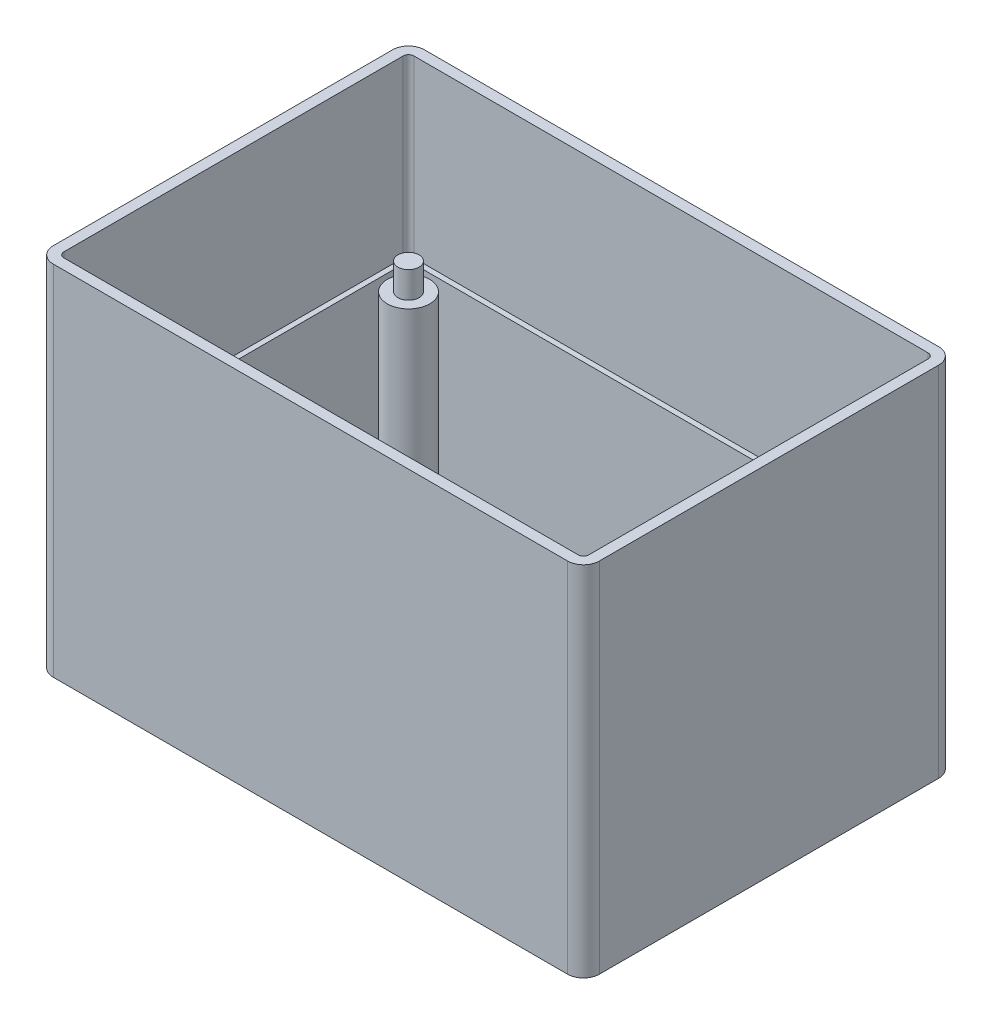
ISO-10303-21;
HEADER;
FILE_DESCRIPTION(('STEP AP214'),'2;1');
FILE_NAME('part.step','',(''),(''),'','','');
FILE_SCHEMA(('AUTOMOTIVE_DESIGN { 1 0 10303 214 1 1 1 1 }'));
ENDSEC;
DATA;
#1=APPLICATION_CONTEXT('core data for automotive mechanical design processes');
#2=APPLICATION_PROTOCOL_DEFINITION('international standard','automotive_design',2000,#1);
#3=PRODUCT_CONTEXT('',#1,'mechanical');
#4=PRODUCT('Part','Part','',(#3));
#5=PRODUCT_RELATED_PRODUCT_CATEGORY('part','',(#4));
#6=PRODUCT_DEFINITION_FORMATION('','',#4);
#7=PRODUCT_DEFINITION_CONTEXT('part definition',#1,'design');
#8=PRODUCT_DEFINITION('design','',#6,#7);
#9=PRODUCT_DEFINITION_SHAPE('','',#8);
#10=(LENGTH_UNIT() NAMED_UNIT(*) SI_UNIT(.MILLI.,.METRE.));
#11=(NAMED_UNIT(*) PLANE_ANGLE_UNIT() SI_UNIT($,.RADIAN.));
#12=(NAMED_UNIT(*) SI_UNIT($,.STERADIAN.) SOLID_ANGLE_UNIT());
#13=UNCERTAINTY_MEASURE_WITH_UNIT(LENGTH_MEASURE(1.E-05),#10,'distance_accuracy_value','');
#14=(GEOMETRIC_REPRESENTATION_CONTEXT(3) GLOBAL_UNCERTAINTY_ASSIGNED_CONTEXT((#13)) GLOBAL_UNIT_ASSIGNED_CONTEXT((#10,
#11,#12)) REPRESENTATION_CONTEXT('',''));
#15=CARTESIAN_POINT('',(0.,0.,0.));
#16=DIRECTION('',(0.,0.,1.));
#17=DIRECTION('',(1.,0.,0.));
#18=AXIS2_PLACEMENT_3D('',#15,#16,#17);
#19=CARTESIAN_POINT('',(103.,-2.5,0.));
#20=DIRECTION('',(1.,0.,0.));
#21=DIRECTION('',(0.,0.,-1.));
#22=AXIS2_PLACEMENT_3D('',#19,#20,#21);
#23=PLANE('',#22);
#24=DIRECTION('',(0.,1.,0.));
#25=VECTOR('',#24,1.);
#26=CARTESIAN_POINT('',(103.,-2.5,-67.));
#27=LINE('',#26,#25);
#28=CARTESIAN_POINT('',(103.,-2.5,-67.));
#29=VERTEX_POINT('',#28);
#30=CARTESIAN_POINT('',(103.,65.,-67.));
#31=VERTEX_POINT('',#30);
#32=EDGE_CURVE('E335',#29,#31,#27,.T.);
#33=ORIENTED_EDGE('',*,*,#32,.T.);
#34=DIRECTION('',(0.,0.,-1.));
#35=VECTOR('',#34,1.);
#36=CARTESIAN_POINT('',(103.,65.,0.));
#37=LINE('',#36,#35);
#38=CARTESIAN_POINT('',(103.,65.,-3.00000000000002));
#39=VERTEX_POINT('',#38);
#40=EDGE_CURVE('E427',#39,#31,#37,.T.);
#41=ORIENTED_EDGE('',*,*,#40,.F.);
#42=DIRECTION('',(0.,1.,0.));
#43=VECTOR('',#42,1.);
#44=CARTESIAN_POINT('',(103.,-2.5,-3.00000000000002));
#45=LINE('',#44,#43);
#46=CARTESIAN_POINT('',(103.,-2.5,-3.00000000000002));
#47=VERTEX_POINT('',#46);
#48=EDGE_CURVE('E336',#47,#39,#45,.T.);
#49=ORIENTED_EDGE('',*,*,#48,.F.);
#50=DIRECTION('',(0.,0.,-1.));
#51=VECTOR('',#50,1.);
#52=CARTESIAN_POINT('',(103.,-2.5,0.));
#53=LINE('',#52,#51);
#54=EDGE_CURVE('E310',#47,#29,#53,.T.);
#55=ORIENTED_EDGE('',*,*,#54,.T.);
#56=EDGE_LOOP('',(#33,#41,#49,#55));
#57=FACE_BOUND('',#56,.T.);
#58=ADVANCED_FACE('F149',(#57),#23,.T.);
#59=CARTESIAN_POINT('',(100.,-2.5,-3.));
#60=DIRECTION('',(0.,1.,0.));
#61=DIRECTION('',(0.,0.,1.));
#62=AXIS2_PLACEMENT_3D('',#59,#60,#61);
#63=CYLINDRICAL_SURFACE('',#62,3.);
#64=ORIENTED_EDGE('',*,*,#48,.T.);
#65=CARTESIAN_POINT('',(100.,65.,-3.));
#66=DIRECTION('',(0.,1.,0.));
#67=DIRECTION('',(0.,0.,1.));
#68=AXIS2_PLACEMENT_3D('',#65,#66,#67);
#69=CIRCLE('',#68,3.);
#70=CARTESIAN_POINT('',(100.,65.,0.));
#71=VERTEX_POINT('',#70);
#72=EDGE_CURVE('E448',#39,#71,#69,.F.);
#73=ORIENTED_EDGE('',*,*,#72,.T.);
#74=DIRECTION('',(0.,1.,0.));
#75=VECTOR('',#74,1.);
#76=CARTESIAN_POINT('',(100.,-2.5,0.));
#77=LINE('',#76,#75);
#78=CARTESIAN_POINT('',(100.,-2.5,0.));
#79=VERTEX_POINT('',#78);
#80=EDGE_CURVE('E339',#79,#71,#77,.T.);
#81=ORIENTED_EDGE('',*,*,#80,.F.);
#82=CARTESIAN_POINT('',(100.,-2.5,-3.));
#83=DIRECTION('',(0.,1.,0.));
#84=DIRECTION('',(0.,0.,1.));
#85=AXIS2_PLACEMENT_3D('',#82,#83,#84);
#86=CIRCLE('',#85,3.);
#87=EDGE_CURVE('E333',#47,#79,#86,.F.);
#88=ORIENTED_EDGE('',*,*,#87,.F.);
#89=EDGE_LOOP('',(#64,#73,#81,#88));
#90=FACE_BOUND('',#89,.T.);
#91=ADVANCED_FACE('F514',(#90),#63,.T.);
#92=CARTESIAN_POINT('',(0.,-2.5,0.));
#93=DIRECTION('',(0.,0.,1.));
#94=DIRECTION('',(1.,0.,0.));
#95=AXIS2_PLACEMENT_3D('',#92,#93,#94);
#96=PLANE('',#95);
#97=ORIENTED_EDGE('',*,*,#80,.T.);
#98=DIRECTION('',(1.,0.,0.));
#99=VECTOR('',#98,1.);
#100=CARTESIAN_POINT('',(0.,65.,0.));
#101=LINE('',#100,#99);
#102=CARTESIAN_POINT('',(3.00000000000002,65.,0.));
#103=VERTEX_POINT('',#102);
#104=EDGE_CURVE('E445',#103,#71,#101,.T.);
#105=ORIENTED_EDGE('',*,*,#104,.F.);
#106=DIRECTION('',(0.,1.,0.));
#107=VECTOR('',#106,1.);
#108=CARTESIAN_POINT('',(3.00000000000002,-2.5,0.));
#109=LINE('',#108,#107);
#110=CARTESIAN_POINT('',(3.00000000000002,-2.5,0.));
#111=VERTEX_POINT('',#110);
#112=EDGE_CURVE('E341',#111,#103,#109,.T.);
#113=ORIENTED_EDGE('',*,*,#112,.F.);
#114=DIRECTION('',(1.,0.,0.));
#115=VECTOR('',#114,1.);
#116=CARTESIAN_POINT('',(0.,-2.5,0.));
#117=LINE('',#116,#115);
#118=EDGE_CURVE('E330',#111,#79,#117,.T.);
#119=ORIENTED_EDGE('',*,*,#118,.T.);
#120=EDGE_LOOP('',(#97,#105,#113,#119));
#121=FACE_BOUND('',#120,.T.);
#122=ADVANCED_FACE('F519',(#121),#96,.T.);
#123=CARTESIAN_POINT('',(3.,-2.5,-3.));
#124=DIRECTION('',(0.,1.,0.));
#125=DIRECTION('',(0.,0.,1.));
#126=AXIS2_PLACEMENT_3D('',#123,#124,#125);
#127=CYLINDRICAL_SURFACE('',#126,3.);
#128=ORIENTED_EDGE('',*,*,#112,.T.);
#129=CARTESIAN_POINT('',(3.,65.,-3.));
#130=DIRECTION('',(0.,1.,0.));
#131=DIRECTION('',(0.,0.,1.));
#132=AXIS2_PLACEMENT_3D('',#129,#130,#131);
#133=CIRCLE('',#132,3.);
#134=CARTESIAN_POINT('',(0.,65.,-3.00000000000002));
#135=VERTEX_POINT('',#134);
#136=EDGE_CURVE('E442',#103,#135,#133,.F.);
#137=ORIENTED_EDGE('',*,*,#136,.T.);
#138=DIRECTION('',(0.,1.,0.));
#139=VECTOR('',#138,1.);
#140=CARTESIAN_POINT('',(0.,-2.5,-3.00000000000002));
#141=LINE('',#140,#139);
#142=CARTESIAN_POINT('',(0.,-2.5,-3.00000000000002));
#143=VERTEX_POINT('',#142);
#144=EDGE_CURVE('E343',#143,#135,#141,.T.);
#145=ORIENTED_EDGE('',*,*,#144,.F.);
#146=CARTESIAN_POINT('',(3.,-2.5,-3.));
#147=DIRECTION('',(0.,1.,0.));
#148=DIRECTION('',(0.,0.,1.));
#149=AXIS2_PLACEMENT_3D('',#146,#147,#148);
#150=CIRCLE('',#149,3.);
#151=EDGE_CURVE('E328',#111,#143,#150,.F.);
#152=ORIENTED_EDGE('',*,*,#151,.F.);
#153=EDGE_LOOP('',(#128,#137,#145,#152));
#154=FACE_BOUND('',#153,.T.);
#155=ADVANCED_FACE('F554',(#154),#127,.T.);
#156=CARTESIAN_POINT('',(0.,-2.5,0.));
#157=DIRECTION('',(1.,0.,0.));
#158=DIRECTION('',(0.,0.,-1.));
#159=AXIS2_PLACEMENT_3D('',#156,#157,#158);
#160=PLANE('',#159);
#161=ORIENTED_EDGE('',*,*,#144,.T.);
#162=DIRECTION('',(0.,0.,-1.));
#163=VECTOR('',#162,1.);
#164=CARTESIAN_POINT('',(0.,65.,0.));
#165=LINE('',#164,#163);
#166=CARTESIAN_POINT('',(0.,65.,-67.));
#167=VERTEX_POINT('',#166);
#168=EDGE_CURVE('E439',#135,#167,#165,.T.);
#169=ORIENTED_EDGE('',*,*,#168,.T.);
#170=DIRECTION('',(0.,1.,0.));
#171=VECTOR('',#170,1.);
#172=CARTESIAN_POINT('',(0.,-2.5,-67.));
#173=LINE('',#172,#171);
#174=CARTESIAN_POINT('',(0.,-2.5,-67.));
#175=VERTEX_POINT('',#174);
#176=EDGE_CURVE('E345',#175,#167,#173,.T.);
#177=ORIENTED_EDGE('',*,*,#176,.F.);
#178=DIRECTION('',(0.,0.,-1.));
#179=VECTOR('',#178,1.);
#180=CARTESIAN_POINT('',(0.,-2.5,0.));
#181=LINE('',#180,#179);
#182=EDGE_CURVE('E326',#143,#175,#181,.T.);
#183=ORIENTED_EDGE('',*,*,#182,.F.);
#184=EDGE_LOOP('',(#161,#169,#177,#183));
#185=FACE_BOUND('',#184,.T.);
#186=ADVANCED_FACE('F551',(#185),#160,.F.);
#187=CARTESIAN_POINT('',(3.,-2.5,-67.));
#188=DIRECTION('',(0.,1.,0.));
#189=DIRECTION('',(0.,0.,1.));
#190=AXIS2_PLACEMENT_3D('',#187,#188,#189);
#191=CYLINDRICAL_SURFACE('',#190,3.);
#192=ORIENTED_EDGE('',*,*,#176,.T.);
#193=CARTESIAN_POINT('',(3.,65.,-67.));
#194=DIRECTION('',(0.,1.,0.));
#195=DIRECTION('',(0.,0.,1.));
#196=AXIS2_PLACEMENT_3D('',#193,#194,#195);
#197=CIRCLE('',#196,3.);
#198=CARTESIAN_POINT('',(3.00000000000002,65.,-70.));
#199=VERTEX_POINT('',#198);
#200=EDGE_CURVE('E436',#167,#199,#197,.F.);
#201=ORIENTED_EDGE('',*,*,#200,.T.);
#202=DIRECTION('',(0.,1.,0.));
#203=VECTOR('',#202,1.);
#204=CARTESIAN_POINT('',(3.00000000000002,-2.5,-70.));
#205=LINE('',#204,#203);
#206=CARTESIAN_POINT('',(3.00000000000002,-2.5,-70.));
#207=VERTEX_POINT('',#206);
#208=EDGE_CURVE('E347',#207,#199,#205,.T.);
#209=ORIENTED_EDGE('',*,*,#208,.F.);
#210=CARTESIAN_POINT('',(3.,-2.5,-67.));
#211=DIRECTION('',(0.,1.,0.));
#212=DIRECTION('',(0.,0.,1.));
#213=AXIS2_PLACEMENT_3D('',#210,#211,#212);
#214=CIRCLE('',#213,3.);
#215=EDGE_CURVE('E324',#175,#207,#214,.F.);
#216=ORIENTED_EDGE('',*,*,#215,.F.);
#217=EDGE_LOOP('',(#192,#201,#209,#216));
#218=FACE_BOUND('',#217,.T.);
#219=ADVANCED_FACE('F547',(#218),#191,.T.);
#220=CARTESIAN_POINT('',(0.,-2.5,-70.));
#221=DIRECTION('',(0.,0.,1.));
#222=DIRECTION('',(1.,0.,0.));
#223=AXIS2_PLACEMENT_3D('',#220,#221,#222);
#224=PLANE('',#223);
#225=ORIENTED_EDGE('',*,*,#208,.T.);
#226=DIRECTION('',(1.,0.,0.));
#227=VECTOR('',#226,1.);
#228=CARTESIAN_POINT('',(0.,65.,-70.));
#229=LINE('',#228,#227);
#230=CARTESIAN_POINT('',(100.,65.,-70.));
#231=VERTEX_POINT('',#230);
#232=EDGE_CURVE('E433',#199,#231,#229,.T.);
#233=ORIENTED_EDGE('',*,*,#232,.T.);
#234=DIRECTION('',(0.,1.,0.));
#235=VECTOR('',#234,1.);
#236=CARTESIAN_POINT('',(100.,-2.5,-70.));
#237=LINE('',#236,#235);
#238=CARTESIAN_POINT('',(100.,-2.5,-70.));
#239=VERTEX_POINT('',#238);
#240=EDGE_CURVE('E349',#239,#231,#237,.T.);
#241=ORIENTED_EDGE('',*,*,#240,.F.);
#242=DIRECTION('',(1.,0.,0.));
#243=VECTOR('',#242,1.);
#244=CARTESIAN_POINT('',(0.,-2.5,-70.));
#245=LINE('',#244,#243);
#246=EDGE_CURVE('E322',#207,#239,#245,.T.);
#247=ORIENTED_EDGE('',*,*,#246,.F.);
#248=EDGE_LOOP('',(#225,#233,#241,#247));
#249=FACE_BOUND('',#248,.T.);
#250=ADVANCED_FACE('F543',(#249),#224,.F.);
#251=CARTESIAN_POINT('',(100.,-2.5,-67.));
#252=DIRECTION('',(0.,1.,0.));
#253=DIRECTION('',(0.,0.,1.));
#254=AXIS2_PLACEMENT_3D('',#251,#252,#253);
#255=CYLINDRICAL_SURFACE('',#254,3.);
#256=ORIENTED_EDGE('',*,*,#240,.T.);
#257=CARTESIAN_POINT('',(100.,65.,-67.));
#258=DIRECTION('',(0.,1.,0.));
#259=DIRECTION('',(0.,0.,1.));
#260=AXIS2_PLACEMENT_3D('',#257,#258,#259);
#261=CIRCLE('',#260,3.);
#262=EDGE_CURVE('E430',#31,#231,#261,.T.);
#263=ORIENTED_EDGE('',*,*,#262,.F.);
#264=ORIENTED_EDGE('',*,*,#32,.F.);
#265=CARTESIAN_POINT('',(100.,-2.5,-67.));
#266=DIRECTION('',(0.,1.,0.));
#267=DIRECTION('',(0.,0.,1.));
#268=AXIS2_PLACEMENT_3D('',#265,#266,#267);
#269=CIRCLE('',#268,3.);
#270=EDGE_CURVE('E314',#29,#239,#269,.T.);
#271=ORIENTED_EDGE('',*,*,#270,.T.);
#272=EDGE_LOOP('',(#256,#263,#264,#271));
#273=FACE_BOUND('',#272,.T.);
#274=ADVANCED_FACE('F528',(#273),#255,.T.);
#275=CARTESIAN_POINT('',(0.,-2.5,0.));
#276=DIRECTION('',(0.,1.,0.));
#277=DIRECTION('',(0.,0.,1.));
#278=AXIS2_PLACEMENT_3D('',#275,#276,#277);
#279=PLANE('',#278);
#280=ORIENTED_EDGE('',*,*,#54,.F.);
#281=ORIENTED_EDGE('',*,*,#87,.T.);
#282=ORIENTED_EDGE('',*,*,#118,.F.);
#283=ORIENTED_EDGE('',*,*,#151,.T.);
#284=ORIENTED_EDGE('',*,*,#182,.T.);
#285=ORIENTED_EDGE('',*,*,#215,.T.);
#286=ORIENTED_EDGE('',*,*,#246,.T.);
#287=ORIENTED_EDGE('',*,*,#270,.F.);
#288=EDGE_LOOP('',(#280,#281,#282,#283,#284,#285,#286,#287));
#289=FACE_BOUND('',#288,.T.);
#290=ADVANCED_FACE('F538',(#289),#279,.F.);
#291=CARTESIAN_POINT('',(0.,65.,-2.));
#292=DIRECTION('',(0.,0.,-1.));
#293=DIRECTION('',(-1.,0.,0.));
#294=AXIS2_PLACEMENT_3D('',#291,#292,#293);
#295=PLANE('',#294);
#296=DIRECTION('',(1.,0.,0.));
#297=VECTOR('',#296,1.);
#298=CARTESIAN_POINT('',(0.,32.,-2.));
#299=LINE('',#298,#297);
#300=CARTESIAN_POINT('',(3.00000000000002,32.,-2.));
#301=VERTEX_POINT('',#300);
#302=CARTESIAN_POINT('',(100.,32.,-2.));
#303=VERTEX_POINT('',#302);
#304=EDGE_CURVE('E165',#301,#303,#299,.T.);
#305=ORIENTED_EDGE('',*,*,#304,.F.);
#306=DIRECTION('',(0.,-1.,0.));
#307=VECTOR('',#306,1.);
#308=CARTESIAN_POINT('',(3.00000000000002,65.,-2.));
#309=LINE('',#308,#307);
#310=CARTESIAN_POINT('',(3.00000000000002,65.,-2.));
#311=VERTEX_POINT('',#310);
#312=EDGE_CURVE('E300',#311,#301,#309,.T.);
#313=ORIENTED_EDGE('',*,*,#312,.F.);
#314=DIRECTION('',(1.,0.,0.));
#315=VECTOR('',#314,1.);
#316=CARTESIAN_POINT('',(0.,65.,-2.));
#317=LINE('',#316,#315);
#318=CARTESIAN_POINT('',(100.,65.,-2.));
#319=VERTEX_POINT('',#318);
#320=EDGE_CURVE('E451',#311,#319,#317,.T.);
#321=ORIENTED_EDGE('',*,*,#320,.T.);
#322=DIRECTION('',(0.,-1.,0.));
#323=VECTOR('',#322,1.);
#324=CARTESIAN_POINT('',(100.,65.,-2.));
#325=LINE('',#324,#323);
#326=EDGE_CURVE('E303',#319,#303,#325,.T.);
#327=ORIENTED_EDGE('',*,*,#326,.T.);
#328=EDGE_LOOP('',(#305,#313,#321,#327));
#329=FACE_BOUND('',#328,.T.);
#330=ADVANCED_FACE('F298',(#329),#295,.T.);
#331=CARTESIAN_POINT('',(3.,65.,-3.));
#332=DIRECTION('',(0.,-1.,0.));
#333=DIRECTION('',(0.,0.,-1.));
#334=AXIS2_PLACEMENT_3D('',#331,#332,#333);
#335=CYLINDRICAL_SURFACE('',#334,1.);
#336=ORIENTED_EDGE('',*,*,#312,.T.);
#337=CARTESIAN_POINT('',(3.,32.,-3.));
#338=DIRECTION('',(0.,1.,0.));
#339=DIRECTION('',(0.,0.,1.));
#340=AXIS2_PLACEMENT_3D('',#337,#338,#339);
#341=CIRCLE('',#340,1.);
#342=CARTESIAN_POINT('',(2.,32.,-3.00000000000002));
#343=VERTEX_POINT('',#342);
#344=EDGE_CURVE('E285',#301,#343,#341,.F.);
#345=ORIENTED_EDGE('',*,*,#344,.T.);
#346=DIRECTION('',(0.,-1.,0.));
#347=VECTOR('',#346,1.);
#348=CARTESIAN_POINT('',(2.,65.,-3.00000000000002));
#349=LINE('',#348,#347);
#350=CARTESIAN_POINT('',(2.,65.,-3.00000000000002));
#351=VERTEX_POINT('',#350);
#352=EDGE_CURVE('E311',#351,#343,#349,.T.);
#353=ORIENTED_EDGE('',*,*,#352,.F.);
#354=CARTESIAN_POINT('',(3.,65.,-3.));
#355=DIRECTION('',(0.,1.,0.));
#356=DIRECTION('',(0.,0.,1.));
#357=AXIS2_PLACEMENT_3D('',#354,#355,#356);
#358=CIRCLE('',#357,1.);
#359=EDGE_CURVE('E308',#311,#351,#358,.F.);
#360=ORIENTED_EDGE('',*,*,#359,.F.);
#361=EDGE_LOOP('',(#336,#345,#353,#360));
#362=FACE_BOUND('',#361,.T.);
#363=ADVANCED_FACE('F306',(#362),#335,.F.);
#364=CARTESIAN_POINT('',(2.,65.,0.));
#365=DIRECTION('',(-1.,0.,0.));
#366=DIRECTION('',(0.,0.,1.));
#367=AXIS2_PLACEMENT_3D('',#364,#365,#366);
#368=PLANE('',#367);
#369=ORIENTED_EDGE('',*,*,#352,.T.);
#370=DIRECTION('',(0.,0.,-1.));
#371=VECTOR('',#370,1.);
#372=CARTESIAN_POINT('',(2.,32.,0.));
#373=LINE('',#372,#371);
#374=CARTESIAN_POINT('',(2.,32.,-67.));
#375=VERTEX_POINT('',#374);
#376=EDGE_CURVE('E289',#343,#375,#373,.T.);
#377=ORIENTED_EDGE('',*,*,#376,.T.);
#378=DIRECTION('',(0.,-1.,0.));
#379=VECTOR('',#378,1.);
#380=CARTESIAN_POINT('',(2.,65.,-67.));
#381=LINE('',#380,#379);
#382=CARTESIAN_POINT('',(2.,65.,-67.));
#383=VERTEX_POINT('',#382);
#384=EDGE_CURVE('E316',#383,#375,#381,.T.);
#385=ORIENTED_EDGE('',*,*,#384,.F.);
#386=DIRECTION('',(0.,0.,-1.));
#387=VECTOR('',#386,1.);
#388=CARTESIAN_POINT('',(2.,65.,0.));
#389=LINE('',#388,#387);
#390=EDGE_CURVE('E454',#351,#383,#389,.T.);
#391=ORIENTED_EDGE('',*,*,#390,.F.);
#392=EDGE_LOOP('',(#369,#377,#385,#391));
#393=FACE_BOUND('',#392,.T.);
#394=ADVANCED_FACE('F488',(#393),#368,.F.);
#395=CARTESIAN_POINT('',(3.,65.,-67.));
#396=DIRECTION('',(0.,-1.,0.));
#397=DIRECTION('',(0.,0.,-1.));
#398=AXIS2_PLACEMENT_3D('',#395,#396,#397);
#399=CYLINDRICAL_SURFACE('',#398,1.);
#400=ORIENTED_EDGE('',*,*,#384,.T.);
#401=CARTESIAN_POINT('',(3.,32.,-67.));
#402=DIRECTION('',(0.,1.,0.));
#403=DIRECTION('',(0.,0.,1.));
#404=AXIS2_PLACEMENT_3D('',#401,#402,#403);
#405=CIRCLE('',#404,1.);
#406=CARTESIAN_POINT('',(3.00000000000002,32.,-68.));
#407=VERTEX_POINT('',#406);
#408=EDGE_CURVE('E395',#375,#407,#405,.F.);
#409=ORIENTED_EDGE('',*,*,#408,.T.);
#410=DIRECTION('',(0.,-1.,0.));
#411=VECTOR('',#410,1.);
#412=CARTESIAN_POINT('',(3.00000000000002,65.,-68.));
#413=LINE('',#412,#411);
#414=CARTESIAN_POINT('',(3.00000000000002,65.,-68.));
#415=VERTEX_POINT('',#414);
#416=EDGE_CURVE('E480',#415,#407,#413,.T.);
#417=ORIENTED_EDGE('',*,*,#416,.F.);
#418=CARTESIAN_POINT('',(3.,65.,-67.));
#419=DIRECTION('',(0.,1.,0.));
#420=DIRECTION('',(0.,0.,1.));
#421=AXIS2_PLACEMENT_3D('',#418,#419,#420);
#422=CIRCLE('',#421,1.);
#423=EDGE_CURVE('E457',#383,#415,#422,.F.);
#424=ORIENTED_EDGE('',*,*,#423,.F.);
#425=EDGE_LOOP('',(#400,#409,#417,#424));
#426=FACE_BOUND('',#425,.T.);
#427=ADVANCED_FACE('F485',(#426),#399,.F.);
#428=CARTESIAN_POINT('',(0.,65.,-68.));
#429=DIRECTION('',(0.,0.,-1.));
#430=DIRECTION('',(-1.,0.,0.));
#431=AXIS2_PLACEMENT_3D('',#428,#429,#430);
#432=PLANE('',#431);
#433=ORIENTED_EDGE('',*,*,#416,.T.);
#434=DIRECTION('',(1.,0.,0.));
#435=VECTOR('',#434,1.);
#436=CARTESIAN_POINT('',(0.,32.,-68.));
#437=LINE('',#436,#435);
#438=CARTESIAN_POINT('',(100.,32.,-68.));
#439=VERTEX_POINT('',#438);
#440=EDGE_CURVE('E392',#407,#439,#437,.T.);
#441=ORIENTED_EDGE('',*,*,#440,.T.);
#442=DIRECTION('',(0.,-1.,0.));
#443=VECTOR('',#442,1.);
#444=CARTESIAN_POINT('',(100.,65.,-68.));
#445=LINE('',#444,#443);
#446=CARTESIAN_POINT('',(100.,65.,-68.));
#447=VERTEX_POINT('',#446);
#448=EDGE_CURVE('E477',#447,#439,#445,.T.);
#449=ORIENTED_EDGE('',*,*,#448,.F.);
#450=DIRECTION('',(1.,0.,0.));
#451=VECTOR('',#450,1.);
#452=CARTESIAN_POINT('',(0.,65.,-68.));
#453=LINE('',#452,#451);
#454=EDGE_CURVE('E460',#415,#447,#453,.T.);
#455=ORIENTED_EDGE('',*,*,#454,.F.);
#456=EDGE_LOOP('',(#433,#441,#449,#455));
#457=FACE_BOUND('',#456,.T.);
#458=ADVANCED_FACE('F504',(#457),#432,.F.);
#459=CARTESIAN_POINT('',(100.,65.,-67.));
#460=DIRECTION('',(0.,-1.,0.));
#461=DIRECTION('',(0.,0.,-1.));
#462=AXIS2_PLACEMENT_3D('',#459,#460,#461);
#463=CYLINDRICAL_SURFACE('',#462,1.);
#464=CARTESIAN_POINT('',(100.,32.,-67.));
#465=DIRECTION('',(0.,1.,0.));
#466=DIRECTION('',(0.,0.,1.));
#467=AXIS2_PLACEMENT_3D('',#464,#465,#466);
#468=CIRCLE('',#467,1.);
#469=CARTESIAN_POINT('',(101.,32.,-67.));
#470=VERTEX_POINT('',#469);
#471=EDGE_CURVE('E390',#470,#439,#468,.T.);
#472=ORIENTED_EDGE('',*,*,#471,.F.);
#473=DIRECTION('',(0.,-1.,0.));
#474=VECTOR('',#473,1.);
#475=CARTESIAN_POINT('',(101.,65.,-67.));
#476=LINE('',#475,#474);
#477=CARTESIAN_POINT('',(101.,65.,-67.));
#478=VERTEX_POINT('',#477);
#479=EDGE_CURVE('E474',#478,#470,#476,.T.);
#480=ORIENTED_EDGE('',*,*,#479,.F.);
#481=CARTESIAN_POINT('',(100.,65.,-67.));
#482=DIRECTION('',(0.,1.,0.));
#483=DIRECTION('',(0.,0.,1.));
#484=AXIS2_PLACEMENT_3D('',#481,#482,#483);
#485=CIRCLE('',#484,1.);
#486=EDGE_CURVE('E462',#478,#447,#485,.T.);
#487=ORIENTED_EDGE('',*,*,#486,.T.);
#488=ORIENTED_EDGE('',*,*,#448,.T.);
#489=EDGE_LOOP('',(#472,#480,#487,#488));
#490=FACE_BOUND('',#489,.T.);
#491=ADVANCED_FACE('F501',(#490),#463,.F.);
#492=CARTESIAN_POINT('',(101.,65.,0.));
#493=DIRECTION('',(-1.,0.,0.));
#494=DIRECTION('',(0.,0.,1.));
#495=AXIS2_PLACEMENT_3D('',#492,#493,#494);
#496=PLANE('',#495);
#497=DIRECTION('',(0.,0.,-1.));
#498=VECTOR('',#497,1.);
#499=CARTESIAN_POINT('',(101.,32.,0.));
#500=LINE('',#499,#498);
#501=CARTESIAN_POINT('',(101.,32.,-3.00000000000001));
#502=VERTEX_POINT('',#501);
#503=EDGE_CURVE('E388',#502,#470,#500,.T.);
#504=ORIENTED_EDGE('',*,*,#503,.F.);
#505=DIRECTION('',(0.,-1.,0.));
#506=VECTOR('',#505,1.);
#507=CARTESIAN_POINT('',(101.,65.,-3.00000000000001));
#508=LINE('',#507,#506);
#509=CARTESIAN_POINT('',(101.,65.,-3.00000000000001));
#510=VERTEX_POINT('',#509);
#511=EDGE_CURVE('E471',#510,#502,#508,.T.);
#512=ORIENTED_EDGE('',*,*,#511,.F.);
#513=DIRECTION('',(0.,0.,-1.));
#514=VECTOR('',#513,1.);
#515=CARTESIAN_POINT('',(101.,65.,0.));
#516=LINE('',#515,#514);
#517=EDGE_CURVE('E465',#510,#478,#516,.T.);
#518=ORIENTED_EDGE('',*,*,#517,.T.);
#519=ORIENTED_EDGE('',*,*,#479,.T.);
#520=EDGE_LOOP('',(#504,#512,#518,#519));
#521=FACE_BOUND('',#520,.T.);
#522=ADVANCED_FACE('F499',(#521),#496,.T.);
#523=CARTESIAN_POINT('',(100.,65.,-3.));
#524=DIRECTION('',(0.,-1.,0.));
#525=DIRECTION('',(0.,0.,-1.));
#526=AXIS2_PLACEMENT_3D('',#523,#524,#525);
#527=CYLINDRICAL_SURFACE('',#526,1.);
#528=ORIENTED_EDGE('',*,*,#511,.T.);
#529=CARTESIAN_POINT('',(100.,32.,-3.));
#530=DIRECTION('',(0.,1.,0.));
#531=DIRECTION('',(0.,0.,1.));
#532=AXIS2_PLACEMENT_3D('',#529,#530,#531);
#533=CIRCLE('',#532,1.);
#534=EDGE_CURVE('E304',#502,#303,#533,.F.);
#535=ORIENTED_EDGE('',*,*,#534,.T.);
#536=ORIENTED_EDGE('',*,*,#326,.F.);
#537=CARTESIAN_POINT('',(100.,65.,-3.));
#538=DIRECTION('',(0.,1.,0.));
#539=DIRECTION('',(0.,0.,1.));
#540=AXIS2_PLACEMENT_3D('',#537,#538,#539);
#541=CIRCLE('',#540,1.);
#542=EDGE_CURVE('E468',#510,#319,#541,.F.);
#543=ORIENTED_EDGE('',*,*,#542,.F.);
#544=EDGE_LOOP('',(#528,#535,#536,#543));
#545=FACE_BOUND('',#544,.T.);
#546=ADVANCED_FACE('F495',(#545),#527,.F.);
#547=CARTESIAN_POINT('',(0.,65.,0.));
#548=DIRECTION('',(0.,1.,0.));
#549=DIRECTION('',(0.,0.,1.));
#550=AXIS2_PLACEMENT_3D('',#547,#548,#549);
#551=PLANE('',#550);
#552=ORIENTED_EDGE('',*,*,#40,.T.);
#553=ORIENTED_EDGE('',*,*,#262,.T.);
#554=ORIENTED_EDGE('',*,*,#232,.F.);
#555=ORIENTED_EDGE('',*,*,#200,.F.);
#556=ORIENTED_EDGE('',*,*,#168,.F.);
#557=ORIENTED_EDGE('',*,*,#136,.F.);
#558=ORIENTED_EDGE('',*,*,#104,.T.);
#559=ORIENTED_EDGE('',*,*,#72,.F.);
#560=EDGE_LOOP('',(#552,#553,#554,#555,#556,#557,#558,#559));
#561=FACE_BOUND('',#560,.T.);
#562=ORIENTED_EDGE('',*,*,#320,.F.);
#563=ORIENTED_EDGE('',*,*,#359,.T.);
#564=ORIENTED_EDGE('',*,*,#390,.T.);
#565=ORIENTED_EDGE('',*,*,#423,.T.);
#566=ORIENTED_EDGE('',*,*,#454,.T.);
#567=ORIENTED_EDGE('',*,*,#486,.F.);
#568=ORIENTED_EDGE('',*,*,#517,.F.);
#569=ORIENTED_EDGE('',*,*,#542,.T.);
#570=EDGE_LOOP('',(#562,#563,#564,#565,#566,#567,#568,#569));
#571=FACE_BOUND('',#570,.T.);
#572=ADVANCED_FACE('F490',(#561,#571),#551,.T.);
#573=CARTESIAN_POINT('',(0.,32.,-3.));
#574=DIRECTION('',(0.,0.,-1.));
#575=DIRECTION('',(-1.,0.,0.));
#576=AXIS2_PLACEMENT_3D('',#573,#574,#575);
#577=PLANE('',#576);
#578=DIRECTION('',(1.,0.,0.));
#579=VECTOR('',#578,1.);
#580=CARTESIAN_POINT('',(0.,0.,-3.));
#581=LINE('',#580,#579);
#582=CARTESIAN_POINT('',(3.00000000000003,0.,-3.));
#583=VERTEX_POINT('',#582);
#584=CARTESIAN_POINT('',(100.,0.,-3.00000000000003));
#585=VERTEX_POINT('',#584);
#586=EDGE_CURVE('E384',#583,#585,#581,.T.);
#587=ORIENTED_EDGE('',*,*,#586,.F.);
#588=DIRECTION('',(0.,-1.,0.));
#589=VECTOR('',#588,1.);
#590=CARTESIAN_POINT('',(3.00000000000003,32.,-3.));
#591=LINE('',#590,#589);
#592=CARTESIAN_POINT('',(3.00000000000003,32.,-3.));
#593=VERTEX_POINT('',#592);
#594=EDGE_CURVE('E425',#593,#583,#591,.T.);
#595=ORIENTED_EDGE('',*,*,#594,.F.);
#596=DIRECTION('',(1.,0.,0.));
#597=VECTOR('',#596,1.);
#598=CARTESIAN_POINT('',(0.,32.,-3.));
#599=LINE('',#598,#597);
#600=CARTESIAN_POINT('',(100.,32.,-3.00000000000003));
#601=VERTEX_POINT('',#600);
#602=EDGE_CURVE('E399',#593,#601,#599,.T.);
#603=ORIENTED_EDGE('',*,*,#602,.T.);
#604=DIRECTION('',(0.,-1.,0.));
#605=VECTOR('',#604,1.);
#606=CARTESIAN_POINT('',(100.,32.,-3.00000000000003));
#607=LINE('',#606,#605);
#608=EDGE_CURVE('E410',#601,#585,#607,.T.);
#609=ORIENTED_EDGE('',*,*,#608,.T.);
#610=EDGE_LOOP('',(#587,#595,#603,#609));
#611=FACE_BOUND('',#610,.T.);
#612=ADVANCED_FACE('F601',(#611),#577,.T.);
#613=CARTESIAN_POINT('',(3.00000000000003,32.,0.));
#614=DIRECTION('',(-1.,0.,0.));
#615=DIRECTION('',(0.,0.,1.));
#616=AXIS2_PLACEMENT_3D('',#613,#614,#615);
#617=PLANE('',#616);
#618=DIRECTION('',(0.,0.,-1.));
#619=VECTOR('',#618,1.);
#620=CARTESIAN_POINT('',(3.00000000000003,0.,0.));
#621=LINE('',#620,#619);
#622=CARTESIAN_POINT('',(3.00000000000004,0.,-67.));
#623=VERTEX_POINT('',#622);
#624=EDGE_CURVE('E173',#583,#623,#621,.T.);
#625=ORIENTED_EDGE('',*,*,#624,.T.);
#626=DIRECTION('',(0.,-1.,0.));
#627=VECTOR('',#626,1.);
#628=CARTESIAN_POINT('',(3.00000000000004,32.,-67.));
#629=LINE('',#628,#627);
#630=CARTESIAN_POINT('',(3.00000000000004,32.,-67.));
#631=VERTEX_POINT('',#630);
#632=EDGE_CURVE('E422',#631,#623,#629,.T.);
#633=ORIENTED_EDGE('',*,*,#632,.F.);
#634=DIRECTION('',(0.,0.,-1.));
#635=VECTOR('',#634,1.);
#636=CARTESIAN_POINT('',(3.00000000000003,32.,0.));
#637=LINE('',#636,#635);
#638=EDGE_CURVE('E402',#593,#631,#637,.T.);
#639=ORIENTED_EDGE('',*,*,#638,.F.);
#640=ORIENTED_EDGE('',*,*,#594,.T.);
#641=EDGE_LOOP('',(#625,#633,#639,#640));
#642=FACE_BOUND('',#641,.T.);
#643=ADVANCED_FACE('F611',(#642),#617,.F.);
#644=CARTESIAN_POINT('',(0.,32.,-67.));
#645=DIRECTION('',(0.,0.,-1.));
#646=DIRECTION('',(-1.,0.,0.));
#647=AXIS2_PLACEMENT_3D('',#644,#645,#646);
#648=PLANE('',#647);
#649=DIRECTION('',(1.,0.,0.));
#650=VECTOR('',#649,1.);
#651=CARTESIAN_POINT('',(0.,0.,-67.));
#652=LINE('',#651,#650);
#653=CARTESIAN_POINT('',(100.,0.,-67.));
#654=VERTEX_POINT('',#653);
#655=EDGE_CURVE('E413',#623,#654,#652,.T.);
#656=ORIENTED_EDGE('',*,*,#655,.T.);
#657=DIRECTION('',(0.,-1.,0.));
#658=VECTOR('',#657,1.);
#659=CARTESIAN_POINT('',(100.,32.,-67.));
#660=LINE('',#659,#658);
#661=CARTESIAN_POINT('',(100.,32.,-67.));
#662=VERTEX_POINT('',#661);
#663=EDGE_CURVE('E419',#662,#654,#660,.T.);
#664=ORIENTED_EDGE('',*,*,#663,.F.);
#665=DIRECTION('',(1.,0.,0.));
#666=VECTOR('',#665,1.);
#667=CARTESIAN_POINT('',(0.,32.,-67.));
#668=LINE('',#667,#666);
#669=EDGE_CURVE('E405',#631,#662,#668,.T.);
#670=ORIENTED_EDGE('',*,*,#669,.F.);
#671=ORIENTED_EDGE('',*,*,#632,.T.);
#672=EDGE_LOOP('',(#656,#664,#670,#671));
#673=FACE_BOUND('',#672,.T.);
#674=ADVANCED_FACE('F607',(#673),#648,.F.);
#675=CARTESIAN_POINT('',(100.,32.,0.));
#676=DIRECTION('',(-1.,0.,0.));
#677=DIRECTION('',(0.,0.,1.));
#678=AXIS2_PLACEMENT_3D('',#675,#676,#677);
#679=PLANE('',#678);
#680=DIRECTION('',(0.,0.,-1.));
#681=VECTOR('',#680,1.);
#682=CARTESIAN_POINT('',(100.,0.,0.));
#683=LINE('',#682,#681);
#684=EDGE_CURVE('E294',#585,#654,#683,.T.);
#685=ORIENTED_EDGE('',*,*,#684,.F.);
#686=ORIENTED_EDGE('',*,*,#608,.F.);
#687=DIRECTION('',(0.,0.,-1.));
#688=VECTOR('',#687,1.);
#689=CARTESIAN_POINT('',(100.,32.,0.));
#690=LINE('',#689,#688);
#691=EDGE_CURVE('E407',#601,#662,#690,.T.);
#692=ORIENTED_EDGE('',*,*,#691,.T.);
#693=ORIENTED_EDGE('',*,*,#663,.T.);
#694=EDGE_LOOP('',(#685,#686,#692,#693));
#695=FACE_BOUND('',#694,.T.);
#696=ADVANCED_FACE('F591',(#695),#679,.T.);
#697=CARTESIAN_POINT('',(0.,32.,0.));
#698=DIRECTION('',(0.,1.,0.));
#699=DIRECTION('',(0.,0.,1.));
#700=AXIS2_PLACEMENT_3D('',#697,#698,#699);
#701=PLANE('',#700);
#702=ORIENTED_EDGE('',*,*,#344,.F.);
#703=ORIENTED_EDGE('',*,*,#304,.T.);
#704=ORIENTED_EDGE('',*,*,#534,.F.);
#705=ORIENTED_EDGE('',*,*,#503,.T.);
#706=ORIENTED_EDGE('',*,*,#471,.T.);
#707=ORIENTED_EDGE('',*,*,#440,.F.);
#708=ORIENTED_EDGE('',*,*,#408,.F.);
#709=ORIENTED_EDGE('',*,*,#376,.F.);
#710=EDGE_LOOP('',(#702,#703,#704,#705,#706,#707,#708,#709));
#711=FACE_BOUND('',#710,.T.);
#712=ORIENTED_EDGE('',*,*,#602,.F.);
#713=ORIENTED_EDGE('',*,*,#638,.T.);
#714=ORIENTED_EDGE('',*,*,#669,.T.);
#715=ORIENTED_EDGE('',*,*,#691,.F.);
#716=EDGE_LOOP('',(#712,#713,#714,#715));
#717=FACE_BOUND('',#716,.T.);
#718=ADVANCED_FACE('F286',(#711,#717),#701,.T.);
#719=CARTESIAN_POINT('',(0.,0.,0.));
#720=DIRECTION('',(0.,1.,0.));
#721=DIRECTION('',(0.,0.,1.));
#722=AXIS2_PLACEMENT_3D('',#719,#720,#721);
#723=PLANE('',#722);
#724=CARTESIAN_POINT('',(7.99999999999999,0.,-7.99999999999999));
#725=DIRECTION('',(0.,1.,0.));
#726=DIRECTION('',(0.,0.,1.));
#727=AXIS2_PLACEMENT_3D('',#724,#725,#726);
#728=CIRCLE('',#727,4.);
#729=CARTESIAN_POINT('',(7.99999999999999,0.,-3.99999999999999));
#730=VERTEX_POINT('',#729);
#731=EDGE_CURVE('E152',#730,#730,#728,.T.);
#732=ORIENTED_EDGE('',*,*,#731,.F.);
#733=EDGE_LOOP('',(#732));
#734=FACE_BOUND('',#733,.T.);
#735=CARTESIAN_POINT('',(95.,0.,-8.));
#736=DIRECTION('',(0.,1.,0.));
#737=DIRECTION('',(0.,0.,1.));
#738=AXIS2_PLACEMENT_3D('',#735,#736,#737);
#739=CIRCLE('',#738,3.99999999999999);
#740=CARTESIAN_POINT('',(95.,0.,-4.00000000000001));
#741=VERTEX_POINT('',#740);
#742=EDGE_CURVE('E371',#741,#741,#739,.T.);
#743=ORIENTED_EDGE('',*,*,#742,.F.);
#744=EDGE_LOOP('',(#743));
#745=FACE_BOUND('',#744,.T.);
#746=CARTESIAN_POINT('',(95.,0.,-62.));
#747=DIRECTION('',(0.,1.,0.));
#748=DIRECTION('',(0.,0.,1.));
#749=AXIS2_PLACEMENT_3D('',#746,#747,#748);
#750=CIRCLE('',#749,3.99999999999999);
#751=CARTESIAN_POINT('',(95.,0.,-58.));
#752=VERTEX_POINT('',#751);
#753=EDGE_CURVE('E338',#752,#752,#750,.T.);
#754=ORIENTED_EDGE('',*,*,#753,.F.);
#755=EDGE_LOOP('',(#754));
#756=FACE_BOUND('',#755,.T.);
#757=CARTESIAN_POINT('',(7.99999999999998,0.,-62.));
#758=DIRECTION('',(0.,1.,0.));
#759=DIRECTION('',(0.,0.,1.));
#760=AXIS2_PLACEMENT_3D('',#757,#758,#759);
#761=CIRCLE('',#760,4.);
#762=CARTESIAN_POINT('',(7.99999999999998,0.,-58.));
#763=VERTEX_POINT('',#762);
#764=EDGE_CURVE('E380',#763,#763,#761,.T.);
#765=ORIENTED_EDGE('',*,*,#764,.F.);
#766=EDGE_LOOP('',(#765));
#767=FACE_BOUND('',#766,.T.);
#768=ORIENTED_EDGE('',*,*,#586,.T.);
#769=ORIENTED_EDGE('',*,*,#684,.T.);
#770=ORIENTED_EDGE('',*,*,#655,.F.);
#771=ORIENTED_EDGE('',*,*,#624,.F.);
#772=EDGE_LOOP('',(#768,#769,#770,#771));
#773=FACE_BOUND('',#772,.T.);
#774=ADVANCED_FACE('F580',(#734,#745,#756,#767,#773),#723,.T.);
#775=CARTESIAN_POINT('',(7.99999999999998,32.,-62.));
#776=DIRECTION('',(0.,-1.,0.));
#777=DIRECTION('',(0.,0.,-1.));
#778=AXIS2_PLACEMENT_3D('',#775,#776,#777);
#779=CYLINDRICAL_SURFACE('',#778,4.);
#780=CARTESIAN_POINT('',(7.99999999999998,32.,-62.));
#781=DIRECTION('',(0.,1.,0.));
#782=DIRECTION('',(0.,0.,1.));
#783=AXIS2_PLACEMENT_3D('',#780,#781,#782);
#784=CIRCLE('',#783,4.);
#785=CARTESIAN_POINT('',(7.99999999999998,32.,-58.));
#786=VERTEX_POINT('',#785);
#787=EDGE_CURVE('E381',#786,#786,#784,.T.);
#788=ORIENTED_EDGE('',*,*,#787,.F.);
#789=EDGE_LOOP('',(#788));
#790=FACE_BOUND('',#789,.T.);
#791=ORIENTED_EDGE('',*,*,#764,.T.);
#792=EDGE_LOOP('',(#791));
#793=FACE_BOUND('',#792,.T.);
#794=ADVANCED_FACE('F582',(#790,#793),#779,.T.);
#795=CARTESIAN_POINT('',(0.,32.,0.));
#796=DIRECTION('',(0.,1.,0.));
#797=DIRECTION('',(0.,0.,1.));
#798=AXIS2_PLACEMENT_3D('',#795,#796,#797);
#799=PLANE('',#798);
#800=CARTESIAN_POINT('',(7.99999999999998,32.,-62.));
#801=DIRECTION('',(0.,1.,0.));
#802=DIRECTION('',(0.,0.,1.));
#803=AXIS2_PLACEMENT_3D('',#800,#801,#802);
#804=CIRCLE('',#803,1.99999999999999);
#805=CARTESIAN_POINT('',(7.99999999999998,32.,-60.));
#806=VERTEX_POINT('',#805);
#807=EDGE_CURVE('E355',#806,#806,#804,.T.);
#808=ORIENTED_EDGE('',*,*,#807,.F.);
#809=EDGE_LOOP('',(#808));
#810=FACE_BOUND('',#809,.T.);
#811=ORIENTED_EDGE('',*,*,#787,.T.);
#812=EDGE_LOOP('',(#811));
#813=FACE_BOUND('',#812,.T.);
#814=ADVANCED_FACE('F588',(#810,#813),#799,.T.);
#815=CARTESIAN_POINT('',(95.,32.,-62.));
#816=DIRECTION('',(0.,-1.,0.));
#817=DIRECTION('',(0.,0.,-1.));
#818=AXIS2_PLACEMENT_3D('',#815,#816,#817);
#819=CYLINDRICAL_SURFACE('',#818,3.99999999999999);
#820=CARTESIAN_POINT('',(95.,32.,-62.));
#821=DIRECTION('',(0.,1.,0.));
#822=DIRECTION('',(0.,0.,1.));
#823=AXIS2_PLACEMENT_3D('',#820,#821,#822);
#824=CIRCLE('',#823,3.99999999999999);
#825=CARTESIAN_POINT('',(95.,32.,-58.));
#826=VERTEX_POINT('',#825);
#827=EDGE_CURVE('E375',#826,#826,#824,.F.);
#828=ORIENTED_EDGE('',*,*,#827,.T.);
#829=EDGE_LOOP('',(#828));
#830=FACE_BOUND('',#829,.T.);
#831=ORIENTED_EDGE('',*,*,#753,.T.);
#832=EDGE_LOOP('',(#831));
#833=FACE_BOUND('',#832,.T.);
#834=ADVANCED_FACE('F686',(#830,#833),#819,.T.);
#835=CARTESIAN_POINT('',(0.,32.,0.));
#836=DIRECTION('',(0.,1.,0.));
#837=DIRECTION('',(0.,0.,1.));
#838=AXIS2_PLACEMENT_3D('',#835,#836,#837);
#839=PLANE('',#838);
#840=CARTESIAN_POINT('',(95.,32.,-62.));
#841=DIRECTION('',(0.,1.,0.));
#842=DIRECTION('',(0.,0.,1.));
#843=AXIS2_PLACEMENT_3D('',#840,#841,#842);
#844=CIRCLE('',#843,1.99999999999998);
#845=CARTESIAN_POINT('',(95.,32.,-60.0000000000001));
#846=VERTEX_POINT('',#845);
#847=EDGE_CURVE('E359',#846,#846,#844,.T.);
#848=ORIENTED_EDGE('',*,*,#847,.F.);
#849=EDGE_LOOP('',(#848));
#850=FACE_BOUND('',#849,.T.);
#851=ORIENTED_EDGE('',*,*,#827,.F.);
#852=EDGE_LOOP('',(#851));
#853=FACE_BOUND('',#852,.T.);
#854=ADVANCED_FACE('F691',(#850,#853),#839,.T.);
#855=CARTESIAN_POINT('',(95.,32.,-8.));
#856=DIRECTION('',(0.,-1.,0.));
#857=DIRECTION('',(0.,0.,-1.));
#858=AXIS2_PLACEMENT_3D('',#855,#856,#857);
#859=CYLINDRICAL_SURFACE('',#858,3.99999999999999);
#860=CARTESIAN_POINT('',(95.,32.,-8.));
#861=DIRECTION('',(0.,1.,0.));
#862=DIRECTION('',(0.,0.,1.));
#863=AXIS2_PLACEMENT_3D('',#860,#861,#862);
#864=CIRCLE('',#863,3.99999999999999);
#865=CARTESIAN_POINT('',(95.,32.,-4.00000000000001));
#866=VERTEX_POINT('',#865);
#867=EDGE_CURVE('E372',#866,#866,#864,.T.);
#868=ORIENTED_EDGE('',*,*,#867,.F.);
#869=EDGE_LOOP('',(#868));
#870=FACE_BOUND('',#869,.T.);
#871=ORIENTED_EDGE('',*,*,#742,.T.);
#872=EDGE_LOOP('',(#871));
#873=FACE_BOUND('',#872,.T.);
#874=ADVANCED_FACE('F699',(#870,#873),#859,.T.);
#875=CARTESIAN_POINT('',(0.,32.,0.));
#876=DIRECTION('',(0.,1.,0.));
#877=DIRECTION('',(0.,0.,1.));
#878=AXIS2_PLACEMENT_3D('',#875,#876,#877);
#879=PLANE('',#878);
#880=CARTESIAN_POINT('',(95.,32.,-8.));
#881=DIRECTION('',(0.,1.,0.));
#882=DIRECTION('',(0.,0.,1.));
#883=AXIS2_PLACEMENT_3D('',#880,#881,#882);
#884=CIRCLE('',#883,1.99999999999998);
#885=CARTESIAN_POINT('',(95.,32.,-6.00000000000002));
#886=VERTEX_POINT('',#885);
#887=EDGE_CURVE('E157',#886,#886,#884,.T.);
#888=ORIENTED_EDGE('',*,*,#887,.F.);
#889=EDGE_LOOP('',(#888));
#890=FACE_BOUND('',#889,.T.);
#891=ORIENTED_EDGE('',*,*,#867,.T.);
#892=EDGE_LOOP('',(#891));
#893=FACE_BOUND('',#892,.T.);
#894=ADVANCED_FACE('F704',(#890,#893),#879,.T.);
#895=CARTESIAN_POINT('',(7.99999999999999,32.,-7.99999999999999));
#896=DIRECTION('',(0.,-1.,0.));
#897=DIRECTION('',(0.,0.,-1.));
#898=AXIS2_PLACEMENT_3D('',#895,#896,#897);
#899=CYLINDRICAL_SURFACE('',#898,4.);
#900=CARTESIAN_POINT('',(7.99999999999999,32.,-7.99999999999999));
#901=DIRECTION('',(0.,1.,0.));
#902=DIRECTION('',(0.,0.,1.));
#903=AXIS2_PLACEMENT_3D('',#900,#901,#902);
#904=CIRCLE('',#903,4.);
#905=CARTESIAN_POINT('',(7.99999999999999,32.,-3.99999999999999));
#906=VERTEX_POINT('',#905);
#907=EDGE_CURVE('E368',#906,#906,#904,.F.);
#908=ORIENTED_EDGE('',*,*,#907,.T.);
#909=EDGE_LOOP('',(#908));
#910=FACE_BOUND('',#909,.T.);
#911=ORIENTED_EDGE('',*,*,#731,.T.);
#912=EDGE_LOOP('',(#911));
#913=FACE_BOUND('',#912,.T.);
#914=ADVANCED_FACE('F712',(#910,#913),#899,.T.);
#915=CARTESIAN_POINT('',(0.,32.,0.));
#916=DIRECTION('',(0.,1.,0.));
#917=DIRECTION('',(0.,0.,1.));
#918=AXIS2_PLACEMENT_3D('',#915,#916,#917);
#919=PLANE('',#918);
#920=CARTESIAN_POINT('',(7.99999999999999,32.,-7.99999999999999));
#921=DIRECTION('',(0.,1.,0.));
#922=DIRECTION('',(0.,0.,1.));
#923=AXIS2_PLACEMENT_3D('',#920,#921,#922);
#924=CIRCLE('',#923,2.);
#925=CARTESIAN_POINT('',(7.99999999999999,32.,-5.99999999999999));
#926=VERTEX_POINT('',#925);
#927=EDGE_CURVE('E12',#926,#926,#924,.T.);
#928=ORIENTED_EDGE('',*,*,#927,.F.);
#929=EDGE_LOOP('',(#928));
#930=FACE_BOUND('',#929,.T.);
#931=ORIENTED_EDGE('',*,*,#907,.F.);
#932=EDGE_LOOP('',(#931));
#933=FACE_BOUND('',#932,.T.);
#934=ADVANCED_FACE('F717',(#930,#933),#919,.T.);
#935=CARTESIAN_POINT('',(7.99999999999998,37.,-62.));
#936=DIRECTION('',(0.,-1.,0.));
#937=DIRECTION('',(0.,0.,-1.));
#938=AXIS2_PLACEMENT_3D('',#935,#936,#937);
#939=CYLINDRICAL_SURFACE('',#938,1.99999999999999);
#940=CARTESIAN_POINT('',(7.99999999999998,37.,-62.));
#941=DIRECTION('',(0.,1.,0.));
#942=DIRECTION('',(0.,0.,1.));
#943=AXIS2_PLACEMENT_3D('',#940,#941,#942);
#944=CIRCLE('',#943,1.99999999999999);
#945=CARTESIAN_POINT('',(7.99999999999998,37.,-60.));
#946=VERTEX_POINT('',#945);
#947=EDGE_CURVE('E367',#946,#946,#944,.T.);
#948=ORIENTED_EDGE('',*,*,#947,.F.);
#949=EDGE_LOOP('',(#948));
#950=FACE_BOUND('',#949,.T.);
#951=ORIENTED_EDGE('',*,*,#807,.T.);
#952=EDGE_LOOP('',(#951));
#953=FACE_BOUND('',#952,.T.);
#954=ADVANCED_FACE('F732',(#950,#953),#939,.T.);
#955=CARTESIAN_POINT('',(7.99999999999998,37.,-62.));
#956=DIRECTION('',(0.,1.,0.));
#957=DIRECTION('',(0.,0.,1.));
#958=AXIS2_PLACEMENT_3D('',#955,#956,#957);
#959=PLANE('',#958);
#960=ORIENTED_EDGE('',*,*,#947,.T.);
#961=EDGE_LOOP('',(#960));
#962=FACE_BOUND('',#961,.T.);
#963=ADVANCED_FACE('F737',(#962),#959,.T.);
#964=CARTESIAN_POINT('',(95.,37.,-62.));
#965=DIRECTION('',(0.,-1.,0.));
#966=DIRECTION('',(0.,0.,-1.));
#967=AXIS2_PLACEMENT_3D('',#964,#965,#966);
#968=CYLINDRICAL_SURFACE('',#967,1.99999999999998);
#969=CARTESIAN_POINT('',(95.,37.,-62.));
#970=DIRECTION('',(0.,1.,0.));
#971=DIRECTION('',(0.,0.,1.));
#972=AXIS2_PLACEMENT_3D('',#969,#970,#971);
#973=CIRCLE('',#972,1.99999999999998);
#974=CARTESIAN_POINT('',(95.,37.,-60.0000000000001));
#975=VERTEX_POINT('',#974);
#976=EDGE_CURVE('E838',#975,#975,#973,.T.);
#977=ORIENTED_EDGE('',*,*,#976,.F.);
#978=EDGE_LOOP('',(#977));
#979=FACE_BOUND('',#978,.T.);
#980=ORIENTED_EDGE('',*,*,#847,.T.);
#981=EDGE_LOOP('',(#980));
#982=FACE_BOUND('',#981,.T.);
#983=ADVANCED_FACE('F747',(#979,#982),#968,.T.);
#984=CARTESIAN_POINT('',(95.,37.,-62.));
#985=DIRECTION('',(0.,1.,0.));
#986=DIRECTION('',(0.,0.,1.));
#987=AXIS2_PLACEMENT_3D('',#984,#985,#986);
#988=PLANE('',#987);
#989=ORIENTED_EDGE('',*,*,#976,.T.);
#990=EDGE_LOOP('',(#989));
#991=FACE_BOUND('',#990,.T.);
#992=ADVANCED_FACE('F764',(#991),#988,.T.);
#993=CARTESIAN_POINT('',(95.,37.,-8.));
#994=DIRECTION('',(0.,-1.,0.));
#995=DIRECTION('',(0.,0.,-1.));
#996=AXIS2_PLACEMENT_3D('',#993,#994,#995);
#997=CYLINDRICAL_SURFACE('',#996,1.99999999999998);
#998=CARTESIAN_POINT('',(95.,37.,-8.));
#999=DIRECTION('',(0.,1.,0.));
#1000=DIRECTION('',(0.,0.,1.));
#1001=AXIS2_PLACEMENT_3D('',#998,#999,#1000);
#1002=CIRCLE('',#1001,1.99999999999998);
#1003=CARTESIAN_POINT('',(95.,37.,-6.00000000000002));
#1004=VERTEX_POINT('',#1003);
#1005=EDGE_CURVE('E835',#1004,#1004,#1002,.T.);
#1006=ORIENTED_EDGE('',*,*,#1005,.F.);
#1007=EDGE_LOOP('',(#1006));
#1008=FACE_BOUND('',#1007,.T.);
#1009=ORIENTED_EDGE('',*,*,#887,.T.);
#1010=EDGE_LOOP('',(#1009));
#1011=FACE_BOUND('',#1010,.T.);
#1012=ADVANCED_FACE('F774',(#1008,#1011),#997,.T.);
#1013=CARTESIAN_POINT('',(95.,37.,-8.));
#1014=DIRECTION('',(0.,1.,0.));
#1015=DIRECTION('',(0.,0.,1.));
#1016=AXIS2_PLACEMENT_3D('',#1013,#1014,#1015);
#1017=PLANE('',#1016);
#1018=ORIENTED_EDGE('',*,*,#1005,.T.);
#1019=EDGE_LOOP('',(#1018));
#1020=FACE_BOUND('',#1019,.T.);
#1021=ADVANCED_FACE('F791',(#1020),#1017,.T.);
#1022=CARTESIAN_POINT('',(7.99999999999999,37.,-7.99999999999999));
#1023=DIRECTION('',(0.,-1.,0.));
#1024=DIRECTION('',(0.,0.,-1.));
#1025=AXIS2_PLACEMENT_3D('',#1022,#1023,#1024);
#1026=CYLINDRICAL_SURFACE('',#1025,2.);
#1027=CARTESIAN_POINT('',(7.99999999999999,37.,-7.99999999999999));
#1028=DIRECTION('',(0.,1.,0.));
#1029=DIRECTION('',(0.,0.,1.));
#1030=AXIS2_PLACEMENT_3D('',#1027,#1028,#1029);
#1031=CIRCLE('',#1030,2.);
#1032=CARTESIAN_POINT('',(7.99999999999999,37.,-5.99999999999999));
#1033=VERTEX_POINT('',#1032);
#1034=EDGE_CURVE('E834',#1033,#1033,#1031,.T.);
#1035=ORIENTED_EDGE('',*,*,#1034,.F.);
#1036=EDGE_LOOP('',(#1035));
#1037=FACE_BOUND('',#1036,.T.);
#1038=ORIENTED_EDGE('',*,*,#927,.T.);
#1039=EDGE_LOOP('',(#1038));
#1040=FACE_BOUND('',#1039,.T.);
#1041=ADVANCED_FACE('F801',(#1037,#1040),#1026,.T.);
#1042=CARTESIAN_POINT('',(7.99999999999999,37.,-7.99999999999999));
#1043=DIRECTION('',(0.,1.,0.));
#1044=DIRECTION('',(0.,0.,1.));
#1045=AXIS2_PLACEMENT_3D('',#1042,#1043,#1044);
#1046=PLANE('',#1045);
#1047=ORIENTED_EDGE('',*,*,#1034,.T.);
#1048=EDGE_LOOP('',(#1047));
#1049=FACE_BOUND('',#1048,.T.);
#1050=ADVANCED_FACE('F818',(#1049),#1046,.T.);
#1051=CLOSED_SHELL('',(#58,#91,#122,#155,#186,#219,#250,#274,#290,#330,#363,#394,#427,#458,#491,
#522,#546,#572,#612,#643,#674,#696,#718,#774,#794,#814,#834,#854,#874,#894,#914,#934,#954,#963,
#983,#992,#1012,#1021,#1041,#1050));
#1052=MANIFOLD_SOLID_BREP('B2',#1051);
#1053=ADVANCED_BREP_SHAPE_REPRESENTATION('',(#18,#1052),#14);
#1054=SHAPE_DEFINITION_REPRESENTATION(#9,#1053);
ENDSEC;
END-ISO-10303-21;
